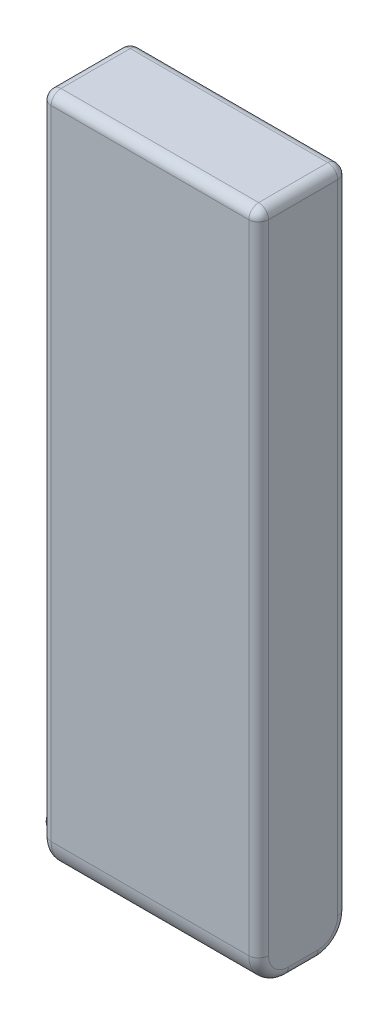
ISO-10303-21;
HEADER;
FILE_DESCRIPTION(('STEP AP214'),'2;1');
FILE_NAME('part.step','',(''),(''),'','','');
FILE_SCHEMA(('AUTOMOTIVE_DESIGN { 1 0 10303 214 1 1 1 1 }'));
ENDSEC;
DATA;
#1=APPLICATION_CONTEXT('core data for automotive mechanical design processes');
#2=APPLICATION_PROTOCOL_DEFINITION('international standard','automotive_design',2000,#1);
#3=PRODUCT_CONTEXT('',#1,'mechanical');
#4=PRODUCT('Part','Part','',(#3));
#5=PRODUCT_RELATED_PRODUCT_CATEGORY('part','',(#4));
#6=PRODUCT_DEFINITION_FORMATION('','',#4);
#7=PRODUCT_DEFINITION_CONTEXT('part definition',#1,'design');
#8=PRODUCT_DEFINITION('design','',#6,#7);
#9=PRODUCT_DEFINITION_SHAPE('','',#8);
#10=(LENGTH_UNIT() NAMED_UNIT(*) SI_UNIT(.MILLI.,.METRE.));
#11=(NAMED_UNIT(*) PLANE_ANGLE_UNIT() SI_UNIT($,.RADIAN.));
#12=(NAMED_UNIT(*) SI_UNIT($,.STERADIAN.) SOLID_ANGLE_UNIT());
#13=UNCERTAINTY_MEASURE_WITH_UNIT(LENGTH_MEASURE(1.E-05),#10,'distance_accuracy_value','');
#14=(GEOMETRIC_REPRESENTATION_CONTEXT(3) GLOBAL_UNCERTAINTY_ASSIGNED_CONTEXT((#13)) GLOBAL_UNIT_ASSIGNED_CONTEXT((#10,
#11,#12)) REPRESENTATION_CONTEXT('',''));
#15=CARTESIAN_POINT('',(0.,0.,0.));
#16=DIRECTION('',(0.,0.,1.));
#17=DIRECTION('',(1.,0.,0.));
#18=AXIS2_PLACEMENT_3D('',#15,#16,#17);
#19=CARTESIAN_POINT('',(22.,68.5,18.));
#20=DIRECTION('',(0.,-1.,0.));
#21=DIRECTION('',(0.,0.,-1.));
#22=AXIS2_PLACEMENT_3D('',#19,#20,#21);
#23=PLANE('',#22);
#24=DIRECTION('',(0.,0.,-1.));
#25=VECTOR('',#24,1.);
#26=CARTESIAN_POINT('',(20.,68.5,18.));
#27=LINE('',#26,#25);
#28=CARTESIAN_POINT('',(20.,68.5,16.));
#29=VERTEX_POINT('',#28);
#30=CARTESIAN_POINT('',(20.,68.5,2.));
#31=VERTEX_POINT('',#30);
#32=EDGE_CURVE('E180',#29,#31,#27,.T.);
#33=ORIENTED_EDGE('',*,*,#32,.T.);
#34=DIRECTION('',(-1.,0.,0.));
#35=VECTOR('',#34,1.);
#36=CARTESIAN_POINT('',(-22.,68.5,2.));
#37=LINE('',#36,#35);
#38=CARTESIAN_POINT('',(-20.,68.5,2.));
#39=VERTEX_POINT('',#38);
#40=EDGE_CURVE('E283',#31,#39,#37,.T.);
#41=ORIENTED_EDGE('',*,*,#40,.T.);
#42=DIRECTION('',(0.,0.,-1.));
#43=VECTOR('',#42,1.);
#44=CARTESIAN_POINT('',(-20.,68.5,18.));
#45=LINE('',#44,#43);
#46=CARTESIAN_POINT('',(-20.,68.5,16.));
#47=VERTEX_POINT('',#46);
#48=EDGE_CURVE('E281',#39,#47,#45,.F.);
#49=ORIENTED_EDGE('',*,*,#48,.T.);
#50=DIRECTION('',(-1.,0.,0.));
#51=VECTOR('',#50,1.);
#52=CARTESIAN_POINT('',(22.,68.5,16.));
#53=LINE('',#52,#51);
#54=EDGE_CURVE('E276',#47,#29,#53,.F.);
#55=ORIENTED_EDGE('',*,*,#54,.T.);
#56=EDGE_LOOP('',(#33,#41,#49,#55));
#57=FACE_BOUND('',#56,.T.);
#58=ADVANCED_FACE('F50',(#57),#23,.F.);
#59=CARTESIAN_POINT('',(-22.,-68.5,18.));
#60=DIRECTION('',(1.,0.,0.));
#61=DIRECTION('',(0.,0.,-1.));
#62=AXIS2_PLACEMENT_3D('',#59,#60,#61);
#63=PLANE('',#62);
#64=CARTESIAN_POINT('',(-22.,-62.5,12.5));
#65=DIRECTION('',(1.,0.,0.));
#66=DIRECTION('',(0.,0.,-1.));
#67=AXIS2_PLACEMENT_3D('',#64,#65,#66);
#68=CIRCLE('',#67,2.5);
#69=CARTESIAN_POINT('',(-22.,-62.5,10.));
#70=VERTEX_POINT('',#69);
#71=EDGE_CURVE('E11',#70,#70,#68,.F.);
#72=ORIENTED_EDGE('',*,*,#71,.F.);
#73=EDGE_LOOP('',(#72));
#74=FACE_BOUND('',#73,.T.);
#75=CARTESIAN_POINT('',(-22.,-62.5,5.5));
#76=DIRECTION('',(1.,0.,0.));
#77=DIRECTION('',(0.,0.,-1.));
#78=AXIS2_PLACEMENT_3D('',#75,#76,#77);
#79=CIRCLE('',#78,2.5);
#80=CARTESIAN_POINT('',(-22.,-62.5,3.00000000000001));
#81=VERTEX_POINT('',#80);
#82=EDGE_CURVE('E54',#81,#81,#79,.F.);
#83=ORIENTED_EDGE('',*,*,#82,.F.);
#84=EDGE_LOOP('',(#83));
#85=FACE_BOUND('',#84,.T.);
#86=DIRECTION('',(0.,0.,-1.));
#87=VECTOR('',#86,1.);
#88=CARTESIAN_POINT('',(-22.,66.5,18.));
#89=LINE('',#88,#87);
#90=CARTESIAN_POINT('',(-22.,66.5,16.));
#91=VERTEX_POINT('',#90);
#92=CARTESIAN_POINT('',(-22.,66.5,2.));
#93=VERTEX_POINT('',#92);
#94=EDGE_CURVE('E268',#91,#93,#89,.T.);
#95=ORIENTED_EDGE('',*,*,#94,.T.);
#96=DIRECTION('',(0.,-1.,0.));
#97=VECTOR('',#96,1.);
#98=CARTESIAN_POINT('',(-22.,-62.5,2.));
#99=LINE('',#98,#97);
#100=CARTESIAN_POINT('',(-22.,-62.5,2.));
#101=VERTEX_POINT('',#100);
#102=EDGE_CURVE('E277',#93,#101,#99,.T.);
#103=ORIENTED_EDGE('',*,*,#102,.T.);
#104=CARTESIAN_POINT('',(-22.,-62.5,6.));
#105=DIRECTION('',(1.,0.,0.));
#106=DIRECTION('',(0.,0.,-1.));
#107=AXIS2_PLACEMENT_3D('',#104,#105,#106);
#108=CIRCLE('',#107,4.);
#109=CARTESIAN_POINT('',(-22.,-66.5,6.));
#110=VERTEX_POINT('',#109);
#111=EDGE_CURVE('E273',#101,#110,#108,.F.);
#112=ORIENTED_EDGE('',*,*,#111,.T.);
#113=DIRECTION('',(0.,0.,-1.));
#114=VECTOR('',#113,1.);
#115=CARTESIAN_POINT('',(-22.,-66.5,18.));
#116=LINE('',#115,#114);
#117=CARTESIAN_POINT('',(-22.,-66.5,12.));
#118=VERTEX_POINT('',#117);
#119=EDGE_CURVE('E275',#110,#118,#116,.F.);
#120=ORIENTED_EDGE('',*,*,#119,.T.);
#121=CARTESIAN_POINT('',(-22.,-62.5,12.));
#122=DIRECTION('',(1.,0.,0.));
#123=DIRECTION('',(0.,0.,-1.));
#124=AXIS2_PLACEMENT_3D('',#121,#122,#123);
#125=CIRCLE('',#124,4.);
#126=CARTESIAN_POINT('',(-22.,-62.5,16.));
#127=VERTEX_POINT('',#126);
#128=EDGE_CURVE('E269',#118,#127,#125,.F.);
#129=ORIENTED_EDGE('',*,*,#128,.T.);
#130=DIRECTION('',(0.,-1.,0.));
#131=VECTOR('',#130,1.);
#132=CARTESIAN_POINT('',(-22.,-68.5,16.));
#133=LINE('',#132,#131);
#134=EDGE_CURVE('E266',#127,#91,#133,.F.);
#135=ORIENTED_EDGE('',*,*,#134,.T.);
#136=EDGE_LOOP('',(#95,#103,#112,#120,#129,#135));
#137=FACE_BOUND('',#136,.T.);
#138=ADVANCED_FACE('F303',(#74,#85,#137),#63,.F.);
#139=CARTESIAN_POINT('',(22.,-68.5,18.));
#140=DIRECTION('',(0.,1.,0.));
#141=DIRECTION('',(0.,0.,1.));
#142=AXIS2_PLACEMENT_3D('',#139,#140,#141);
#143=PLANE('',#142);
#144=DIRECTION('',(1.,0.,0.));
#145=VECTOR('',#144,1.);
#146=CARTESIAN_POINT('',(22.,-68.5,6.));
#147=LINE('',#146,#145);
#148=CARTESIAN_POINT('',(-20.,-68.5,6.));
#149=VERTEX_POINT('',#148);
#150=CARTESIAN_POINT('',(20.,-68.5,6.));
#151=VERTEX_POINT('',#150);
#152=EDGE_CURVE('E314',#149,#151,#147,.T.);
#153=ORIENTED_EDGE('',*,*,#152,.T.);
#154=DIRECTION('',(0.,0.,-1.));
#155=VECTOR('',#154,1.);
#156=CARTESIAN_POINT('',(20.,-68.5,18.));
#157=LINE('',#156,#155);
#158=CARTESIAN_POINT('',(20.,-68.5,12.));
#159=VERTEX_POINT('',#158);
#160=EDGE_CURVE('E253',#151,#159,#157,.F.);
#161=ORIENTED_EDGE('',*,*,#160,.T.);
#162=DIRECTION('',(1.,0.,0.));
#163=VECTOR('',#162,1.);
#164=CARTESIAN_POINT('',(22.,-68.5,12.));
#165=LINE('',#164,#163);
#166=CARTESIAN_POINT('',(-20.,-68.5,12.));
#167=VERTEX_POINT('',#166);
#168=EDGE_CURVE('E217',#159,#167,#165,.F.);
#169=ORIENTED_EDGE('',*,*,#168,.T.);
#170=DIRECTION('',(0.,0.,-1.));
#171=VECTOR('',#170,1.);
#172=CARTESIAN_POINT('',(-20.,-68.5,18.));
#173=LINE('',#172,#171);
#174=EDGE_CURVE('E256',#167,#149,#173,.T.);
#175=ORIENTED_EDGE('',*,*,#174,.T.);
#176=EDGE_LOOP('',(#153,#161,#169,#175));
#177=FACE_BOUND('',#176,.T.);
#178=ADVANCED_FACE('F311',(#177),#143,.F.);
#179=CARTESIAN_POINT('',(22.,-68.5,18.));
#180=DIRECTION('',(-1.,0.,0.));
#181=DIRECTION('',(0.,0.,1.));
#182=AXIS2_PLACEMENT_3D('',#179,#180,#181);
#183=PLANE('',#182);
#184=CARTESIAN_POINT('',(22.,-62.5,6.));
#185=DIRECTION('',(-1.,0.,0.));
#186=DIRECTION('',(0.,0.,1.));
#187=AXIS2_PLACEMENT_3D('',#184,#185,#186);
#188=CIRCLE('',#187,4.);
#189=CARTESIAN_POINT('',(22.,-66.5,6.));
#190=VERTEX_POINT('',#189);
#191=CARTESIAN_POINT('',(22.,-62.5,2.));
#192=VERTEX_POINT('',#191);
#193=EDGE_CURVE('E244',#190,#192,#188,.F.);
#194=ORIENTED_EDGE('',*,*,#193,.T.);
#195=DIRECTION('',(0.,1.,0.));
#196=VECTOR('',#195,1.);
#197=CARTESIAN_POINT('',(22.,68.5,2.));
#198=LINE('',#197,#196);
#199=CARTESIAN_POINT('',(22.,66.5,2.));
#200=VERTEX_POINT('',#199);
#201=EDGE_CURVE('E153',#192,#200,#198,.T.);
#202=ORIENTED_EDGE('',*,*,#201,.T.);
#203=DIRECTION('',(0.,0.,-1.));
#204=VECTOR('',#203,1.);
#205=CARTESIAN_POINT('',(22.,66.5,18.));
#206=LINE('',#205,#204);
#207=CARTESIAN_POINT('',(22.,66.5,16.));
#208=VERTEX_POINT('',#207);
#209=EDGE_CURVE('E150',#200,#208,#206,.F.);
#210=ORIENTED_EDGE('',*,*,#209,.T.);
#211=DIRECTION('',(0.,1.,0.));
#212=VECTOR('',#211,1.);
#213=CARTESIAN_POINT('',(22.,-68.5,16.));
#214=LINE('',#213,#212);
#215=CARTESIAN_POINT('',(22.,-62.5,16.));
#216=VERTEX_POINT('',#215);
#217=EDGE_CURVE('E147',#208,#216,#214,.F.);
#218=ORIENTED_EDGE('',*,*,#217,.T.);
#219=CARTESIAN_POINT('',(22.,-62.5,12.));
#220=DIRECTION('',(-1.,0.,0.));
#221=DIRECTION('',(0.,0.,1.));
#222=AXIS2_PLACEMENT_3D('',#219,#220,#221);
#223=CIRCLE('',#222,4.);
#224=CARTESIAN_POINT('',(22.,-66.5,12.));
#225=VERTEX_POINT('',#224);
#226=EDGE_CURVE('E160',#216,#225,#223,.F.);
#227=ORIENTED_EDGE('',*,*,#226,.T.);
#228=DIRECTION('',(0.,0.,-1.));
#229=VECTOR('',#228,1.);
#230=CARTESIAN_POINT('',(22.,-66.5,18.));
#231=LINE('',#230,#229);
#232=EDGE_CURVE('E250',#225,#190,#231,.T.);
#233=ORIENTED_EDGE('',*,*,#232,.T.);
#234=EDGE_LOOP('',(#194,#202,#210,#218,#227,#233));
#235=FACE_BOUND('',#234,.T.);
#236=ADVANCED_FACE('F149',(#235),#183,.F.);
#237=CARTESIAN_POINT('',(0.,0.,18.));
#238=DIRECTION('',(0.,0.,-1.));
#239=DIRECTION('',(-1.,0.,0.));
#240=AXIS2_PLACEMENT_3D('',#237,#238,#239);
#241=PLANE('',#240);
#242=DIRECTION('',(1.,0.,0.));
#243=VECTOR('',#242,1.);
#244=CARTESIAN_POINT('',(0.,-62.5,18.));
#245=LINE('',#244,#243);
#246=CARTESIAN_POINT('',(-20.,-62.5,18.));
#247=VERTEX_POINT('',#246);
#248=CARTESIAN_POINT('',(20.,-62.5,18.));
#249=VERTEX_POINT('',#248);
#250=EDGE_CURVE('E169',#247,#249,#245,.T.);
#251=ORIENTED_EDGE('',*,*,#250,.T.);
#252=DIRECTION('',(0.,1.,0.));
#253=VECTOR('',#252,1.);
#254=CARTESIAN_POINT('',(20.,0.,18.));
#255=LINE('',#254,#253);
#256=CARTESIAN_POINT('',(20.,66.5,18.));
#257=VERTEX_POINT('',#256);
#258=EDGE_CURVE('E65',#249,#257,#255,.T.);
#259=ORIENTED_EDGE('',*,*,#258,.T.);
#260=DIRECTION('',(-1.,0.,0.));
#261=VECTOR('',#260,1.);
#262=CARTESIAN_POINT('',(0.,66.5,18.));
#263=LINE('',#262,#261);
#264=CARTESIAN_POINT('',(-20.,66.5,18.));
#265=VERTEX_POINT('',#264);
#266=EDGE_CURVE('E66',#257,#265,#263,.T.);
#267=ORIENTED_EDGE('',*,*,#266,.T.);
#268=DIRECTION('',(0.,-1.,0.));
#269=VECTOR('',#268,1.);
#270=CARTESIAN_POINT('',(-20.,0.,18.));
#271=LINE('',#270,#269);
#272=EDGE_CURVE('E224',#265,#247,#271,.T.);
#273=ORIENTED_EDGE('',*,*,#272,.T.);
#274=EDGE_LOOP('',(#251,#259,#267,#273));
#275=FACE_BOUND('',#274,.T.);
#276=ADVANCED_FACE('F286',(#275),#241,.F.);
#277=CARTESIAN_POINT('',(0.,0.,0.));
#278=DIRECTION('',(0.,0.,-1.));
#279=DIRECTION('',(-1.,0.,0.));
#280=AXIS2_PLACEMENT_3D('',#277,#278,#279);
#281=PLANE('',#280);
#282=DIRECTION('',(-1.,0.,0.));
#283=VECTOR('',#282,1.);
#284=CARTESIAN_POINT('',(22.,66.5,0.));
#285=LINE('',#284,#283);
#286=CARTESIAN_POINT('',(-20.,66.5,0.));
#287=VERTEX_POINT('',#286);
#288=CARTESIAN_POINT('',(20.,66.5,0.));
#289=VERTEX_POINT('',#288);
#290=EDGE_CURVE('E328',#287,#289,#285,.F.);
#291=ORIENTED_EDGE('',*,*,#290,.T.);
#292=DIRECTION('',(0.,1.,0.));
#293=VECTOR('',#292,1.);
#294=CARTESIAN_POINT('',(20.,-62.5,0.));
#295=LINE('',#294,#293);
#296=CARTESIAN_POINT('',(20.,-62.5,0.));
#297=VERTEX_POINT('',#296);
#298=EDGE_CURVE('E334',#289,#297,#295,.F.);
#299=ORIENTED_EDGE('',*,*,#298,.T.);
#300=DIRECTION('',(1.,0.,0.));
#301=VECTOR('',#300,1.);
#302=CARTESIAN_POINT('',(-22.,-62.5,0.));
#303=LINE('',#302,#301);
#304=CARTESIAN_POINT('',(-20.,-62.5,0.));
#305=VERTEX_POINT('',#304);
#306=EDGE_CURVE('E291',#297,#305,#303,.F.);
#307=ORIENTED_EDGE('',*,*,#306,.T.);
#308=DIRECTION('',(0.,-1.,0.));
#309=VECTOR('',#308,1.);
#310=CARTESIAN_POINT('',(-20.,68.5,0.));
#311=LINE('',#310,#309);
#312=EDGE_CURVE('E332',#305,#287,#311,.F.);
#313=ORIENTED_EDGE('',*,*,#312,.T.);
#314=EDGE_LOOP('',(#291,#299,#307,#313));
#315=FACE_BOUND('',#314,.T.);
#316=ADVANCED_FACE('F340',(#315),#281,.T.);
#317=CARTESIAN_POINT('',(22.,-62.5,6.));
#318=DIRECTION('',(-1.,0.,0.));
#319=DIRECTION('',(0.,0.,1.));
#320=AXIS2_PLACEMENT_3D('',#317,#318,#319);
#321=CYLINDRICAL_SURFACE('',#320,6.);
#322=ORIENTED_EDGE('',*,*,#306,.F.);
#323=CARTESIAN_POINT('',(20.,-62.5,6.));
#324=DIRECTION('',(-1.,0.,0.));
#325=DIRECTION('',(0.,0.,1.));
#326=AXIS2_PLACEMENT_3D('',#323,#324,#325);
#327=CIRCLE('',#326,6.);
#328=EDGE_CURVE('E242',#297,#151,#327,.T.);
#329=ORIENTED_EDGE('',*,*,#328,.T.);
#330=ORIENTED_EDGE('',*,*,#152,.F.);
#331=CARTESIAN_POINT('',(-20.,-62.5,6.));
#332=DIRECTION('',(1.,0.,0.));
#333=DIRECTION('',(0.,0.,-1.));
#334=AXIS2_PLACEMENT_3D('',#331,#332,#333);
#335=CIRCLE('',#334,6.);
#336=EDGE_CURVE('E318',#149,#305,#335,.T.);
#337=ORIENTED_EDGE('',*,*,#336,.T.);
#338=EDGE_LOOP('',(#322,#329,#330,#337));
#339=FACE_BOUND('',#338,.T.);
#340=ADVANCED_FACE('F320',(#339),#321,.T.);
#341=CARTESIAN_POINT('',(0.,-62.5,12.));
#342=DIRECTION('',(1.,0.,0.));
#343=DIRECTION('',(0.,0.,-1.));
#344=AXIS2_PLACEMENT_3D('',#341,#342,#343);
#345=CYLINDRICAL_SURFACE('',#344,6.);
#346=ORIENTED_EDGE('',*,*,#168,.F.);
#347=CARTESIAN_POINT('',(20.,-62.5,12.));
#348=DIRECTION('',(-1.,0.,0.));
#349=DIRECTION('',(0.,0.,1.));
#350=AXIS2_PLACEMENT_3D('',#347,#348,#349);
#351=CIRCLE('',#350,6.);
#352=EDGE_CURVE('E257',#159,#249,#351,.T.);
#353=ORIENTED_EDGE('',*,*,#352,.T.);
#354=ORIENTED_EDGE('',*,*,#250,.F.);
#355=CARTESIAN_POINT('',(-20.,-62.5,12.));
#356=DIRECTION('',(1.,0.,0.));
#357=DIRECTION('',(0.,0.,-1.));
#358=AXIS2_PLACEMENT_3D('',#355,#356,#357);
#359=CIRCLE('',#358,6.);
#360=EDGE_CURVE('E260',#247,#167,#359,.T.);
#361=ORIENTED_EDGE('',*,*,#360,.T.);
#362=EDGE_LOOP('',(#346,#353,#354,#361));
#363=FACE_BOUND('',#362,.T.);
#364=ADVANCED_FACE('F292',(#363),#345,.T.);
#365=CARTESIAN_POINT('',(-20.,-62.5,12.));
#366=DIRECTION('',(1.,0.,0.));
#367=DIRECTION('',(0.,0.,-1.));
#368=AXIS2_PLACEMENT_3D('',#365,#366,#367);
#369=TOROIDAL_SURFACE('',#368,4.,2.);
#370=CARTESIAN_POINT('',(-20.,-66.5,12.));
#371=DIRECTION('',(0.,0.,-1.));
#372=DIRECTION('',(-1.,0.,0.));
#373=AXIS2_PLACEMENT_3D('',#370,#371,#372);
#374=CIRCLE('',#373,2.);
#375=EDGE_CURVE('E213',#167,#118,#374,.T.);
#376=ORIENTED_EDGE('',*,*,#375,.F.);
#377=ORIENTED_EDGE('',*,*,#360,.F.);
#378=CARTESIAN_POINT('',(-20.,-62.5,16.));
#379=DIRECTION('',(0.,1.,0.));
#380=DIRECTION('',(0.,0.,1.));
#381=AXIS2_PLACEMENT_3D('',#378,#379,#380);
#382=CIRCLE('',#381,2.);
#383=EDGE_CURVE('E216',#127,#247,#382,.T.);
#384=ORIENTED_EDGE('',*,*,#383,.F.);
#385=ORIENTED_EDGE('',*,*,#128,.F.);
#386=EDGE_LOOP('',(#376,#377,#384,#385));
#387=FACE_BOUND('',#386,.T.);
#388=ADVANCED_FACE('F47',(#387),#369,.T.);
#389=CARTESIAN_POINT('',(-20.,0.,16.));
#390=DIRECTION('',(0.,-1.,0.));
#391=DIRECTION('',(0.,0.,-1.));
#392=AXIS2_PLACEMENT_3D('',#389,#390,#391);
#393=CYLINDRICAL_SURFACE('',#392,2.);
#394=ORIENTED_EDGE('',*,*,#383,.T.);
#395=ORIENTED_EDGE('',*,*,#272,.F.);
#396=CARTESIAN_POINT('',(-20.,66.5,16.));
#397=DIRECTION('',(0.,1.,0.));
#398=DIRECTION('',(0.,0.,1.));
#399=AXIS2_PLACEMENT_3D('',#396,#397,#398);
#400=CIRCLE('',#399,2.);
#401=EDGE_CURVE('E209',#91,#265,#400,.T.);
#402=ORIENTED_EDGE('',*,*,#401,.F.);
#403=ORIENTED_EDGE('',*,*,#134,.F.);
#404=EDGE_LOOP('',(#394,#395,#402,#403));
#405=FACE_BOUND('',#404,.T.);
#406=ADVANCED_FACE('F301',(#405),#393,.T.);
#407=CARTESIAN_POINT('',(-20.,-66.5,18.));
#408=DIRECTION('',(0.,0.,-1.));
#409=DIRECTION('',(-1.,0.,0.));
#410=AXIS2_PLACEMENT_3D('',#407,#408,#409);
#411=CYLINDRICAL_SURFACE('',#410,2.);
#412=ORIENTED_EDGE('',*,*,#375,.T.);
#413=ORIENTED_EDGE('',*,*,#119,.F.);
#414=CARTESIAN_POINT('',(-20.,-66.5,6.));
#415=DIRECTION('',(0.,0.,-1.));
#416=DIRECTION('',(-1.,0.,0.));
#417=AXIS2_PLACEMENT_3D('',#414,#415,#416);
#418=CIRCLE('',#417,2.);
#419=EDGE_CURVE('E210',#149,#110,#418,.T.);
#420=ORIENTED_EDGE('',*,*,#419,.F.);
#421=ORIENTED_EDGE('',*,*,#174,.F.);
#422=EDGE_LOOP('',(#412,#413,#420,#421));
#423=FACE_BOUND('',#422,.T.);
#424=ADVANCED_FACE('F310',(#423),#411,.T.);
#425=CARTESIAN_POINT('',(-20.,66.5,16.));
#426=DIRECTION('',(0.,0.,1.));
#427=DIRECTION('',(1.,0.,0.));
#428=AXIS2_PLACEMENT_3D('',#425,#426,#427);
#429=SPHERICAL_SURFACE('',#428,2.);
#430=CARTESIAN_POINT('',(-20.,66.5,16.));
#431=DIRECTION('',(0.,0.,1.));
#432=DIRECTION('',(1.,0.,0.));
#433=AXIS2_PLACEMENT_3D('',#430,#431,#432);
#434=CIRCLE('',#433,2.);
#435=EDGE_CURVE('E203',#91,#47,#434,.F.);
#436=ORIENTED_EDGE('',*,*,#435,.F.);
#437=ORIENTED_EDGE('',*,*,#401,.T.);
#438=CARTESIAN_POINT('',(-20.,66.5,16.));
#439=DIRECTION('',(-1.,0.,0.));
#440=DIRECTION('',(0.,0.,1.));
#441=AXIS2_PLACEMENT_3D('',#438,#439,#440);
#442=CIRCLE('',#441,2.);
#443=EDGE_CURVE('E204',#47,#265,#442,.F.);
#444=ORIENTED_EDGE('',*,*,#443,.F.);
#445=EDGE_LOOP('',(#436,#437,#444));
#446=FACE_BOUND('',#445,.T.);
#447=ADVANCED_FACE('F357',(#446),#429,.T.);
#448=CARTESIAN_POINT('',(-20.,-62.5,6.));
#449=DIRECTION('',(1.,0.,0.));
#450=DIRECTION('',(0.,0.,-1.));
#451=AXIS2_PLACEMENT_3D('',#448,#449,#450);
#452=TOROIDAL_SURFACE('',#451,4.,2.);
#453=ORIENTED_EDGE('',*,*,#419,.T.);
#454=ORIENTED_EDGE('',*,*,#111,.F.);
#455=CARTESIAN_POINT('',(-20.,-62.5,2.));
#456=DIRECTION('',(0.,1.,0.));
#457=DIRECTION('',(0.,0.,1.));
#458=AXIS2_PLACEMENT_3D('',#455,#456,#457);
#459=CIRCLE('',#458,2.);
#460=EDGE_CURVE('E200',#305,#101,#459,.T.);
#461=ORIENTED_EDGE('',*,*,#460,.F.);
#462=ORIENTED_EDGE('',*,*,#336,.F.);
#463=EDGE_LOOP('',(#453,#454,#461,#462));
#464=FACE_BOUND('',#463,.T.);
#465=ADVANCED_FACE('F369',(#464),#452,.T.);
#466=CARTESIAN_POINT('',(20.,0.,16.));
#467=DIRECTION('',(0.,1.,0.));
#468=DIRECTION('',(0.,0.,1.));
#469=AXIS2_PLACEMENT_3D('',#466,#467,#468);
#470=CYLINDRICAL_SURFACE('',#469,2.);
#471=CARTESIAN_POINT('',(20.,66.5,16.));
#472=DIRECTION('',(0.,1.,0.));
#473=DIRECTION('',(0.,0.,1.));
#474=AXIS2_PLACEMENT_3D('',#471,#472,#473);
#475=CIRCLE('',#474,2.);
#476=EDGE_CURVE('E162',#257,#208,#475,.T.);
#477=ORIENTED_EDGE('',*,*,#476,.F.);
#478=ORIENTED_EDGE('',*,*,#258,.F.);
#479=CARTESIAN_POINT('',(20.,-62.5,16.));
#480=DIRECTION('',(0.,-1.,0.));
#481=DIRECTION('',(0.,0.,-1.));
#482=AXIS2_PLACEMENT_3D('',#479,#480,#481);
#483=CIRCLE('',#482,2.);
#484=EDGE_CURVE('E167',#216,#249,#483,.T.);
#485=ORIENTED_EDGE('',*,*,#484,.F.);
#486=ORIENTED_EDGE('',*,*,#217,.F.);
#487=EDGE_LOOP('',(#477,#478,#485,#486));
#488=FACE_BOUND('',#487,.T.);
#489=ADVANCED_FACE('F165',(#488),#470,.T.);
#490=CARTESIAN_POINT('',(0.,66.5,16.));
#491=DIRECTION('',(-1.,0.,0.));
#492=DIRECTION('',(0.,0.,1.));
#493=AXIS2_PLACEMENT_3D('',#490,#491,#492);
#494=CYLINDRICAL_SURFACE('',#493,2.);
#495=ORIENTED_EDGE('',*,*,#443,.T.);
#496=ORIENTED_EDGE('',*,*,#266,.F.);
#497=CARTESIAN_POINT('',(20.,66.5,16.));
#498=DIRECTION('',(1.,0.,0.));
#499=DIRECTION('',(0.,0.,-1.));
#500=AXIS2_PLACEMENT_3D('',#497,#498,#499);
#501=CIRCLE('',#500,2.);
#502=EDGE_CURVE('E176',#29,#257,#501,.T.);
#503=ORIENTED_EDGE('',*,*,#502,.F.);
#504=ORIENTED_EDGE('',*,*,#54,.F.);
#505=EDGE_LOOP('',(#495,#496,#503,#504));
#506=FACE_BOUND('',#505,.T.);
#507=ADVANCED_FACE('F353',(#506),#494,.T.);
#508=CARTESIAN_POINT('',(-20.,66.5,18.));
#509=DIRECTION('',(0.,0.,-1.));
#510=DIRECTION('',(-1.,0.,0.));
#511=AXIS2_PLACEMENT_3D('',#508,#509,#510);
#512=CYLINDRICAL_SURFACE('',#511,2.);
#513=ORIENTED_EDGE('',*,*,#435,.T.);
#514=ORIENTED_EDGE('',*,*,#48,.F.);
#515=CARTESIAN_POINT('',(-20.,66.5,2.));
#516=DIRECTION('',(0.,0.,-1.));
#517=DIRECTION('',(-1.,0.,0.));
#518=AXIS2_PLACEMENT_3D('',#515,#516,#517);
#519=CIRCLE('',#518,2.);
#520=EDGE_CURVE('E193',#93,#39,#519,.T.);
#521=ORIENTED_EDGE('',*,*,#520,.F.);
#522=ORIENTED_EDGE('',*,*,#94,.F.);
#523=EDGE_LOOP('',(#513,#514,#521,#522));
#524=FACE_BOUND('',#523,.T.);
#525=ADVANCED_FACE('F360',(#524),#512,.T.);
#526=CARTESIAN_POINT('',(-20.,-68.5,2.));
#527=DIRECTION('',(0.,1.,0.));
#528=DIRECTION('',(0.,0.,1.));
#529=AXIS2_PLACEMENT_3D('',#526,#527,#528);
#530=CYLINDRICAL_SURFACE('',#529,2.);
#531=ORIENTED_EDGE('',*,*,#460,.T.);
#532=ORIENTED_EDGE('',*,*,#102,.F.);
#533=CARTESIAN_POINT('',(-20.,66.5,2.));
#534=DIRECTION('',(0.,1.,0.));
#535=DIRECTION('',(0.,0.,1.));
#536=AXIS2_PLACEMENT_3D('',#533,#534,#535);
#537=CIRCLE('',#536,2.);
#538=EDGE_CURVE('E183',#287,#93,#537,.T.);
#539=ORIENTED_EDGE('',*,*,#538,.F.);
#540=ORIENTED_EDGE('',*,*,#312,.F.);
#541=EDGE_LOOP('',(#531,#532,#539,#540));
#542=FACE_BOUND('',#541,.T.);
#543=ADVANCED_FACE('F368',(#542),#530,.T.);
#544=CARTESIAN_POINT('',(20.,-62.5,12.));
#545=DIRECTION('',(-1.,0.,0.));
#546=DIRECTION('',(0.,0.,1.));
#547=AXIS2_PLACEMENT_3D('',#544,#545,#546);
#548=TOROIDAL_SURFACE('',#547,4.,2.);
#549=ORIENTED_EDGE('',*,*,#484,.T.);
#550=ORIENTED_EDGE('',*,*,#352,.F.);
#551=CARTESIAN_POINT('',(20.,-66.5,12.));
#552=DIRECTION('',(0.,0.,-1.));
#553=DIRECTION('',(-1.,0.,0.));
#554=AXIS2_PLACEMENT_3D('',#551,#552,#553);
#555=CIRCLE('',#554,2.);
#556=EDGE_CURVE('E182',#225,#159,#555,.T.);
#557=ORIENTED_EDGE('',*,*,#556,.F.);
#558=ORIENTED_EDGE('',*,*,#226,.F.);
#559=EDGE_LOOP('',(#549,#550,#557,#558));
#560=FACE_BOUND('',#559,.T.);
#561=ADVANCED_FACE('F407',(#560),#548,.T.);
#562=CARTESIAN_POINT('',(20.,66.5,16.));
#563=DIRECTION('',(0.,0.,1.));
#564=DIRECTION('',(1.,0.,0.));
#565=AXIS2_PLACEMENT_3D('',#562,#563,#564);
#566=SPHERICAL_SURFACE('',#565,2.);
#567=ORIENTED_EDGE('',*,*,#502,.T.);
#568=ORIENTED_EDGE('',*,*,#476,.T.);
#569=CARTESIAN_POINT('',(20.,66.5,16.));
#570=DIRECTION('',(0.,0.,1.));
#571=DIRECTION('',(1.,0.,0.));
#572=AXIS2_PLACEMENT_3D('',#569,#570,#571);
#573=CIRCLE('',#572,2.);
#574=EDGE_CURVE('E172',#29,#208,#573,.F.);
#575=ORIENTED_EDGE('',*,*,#574,.F.);
#576=EDGE_LOOP('',(#567,#568,#575));
#577=FACE_BOUND('',#576,.T.);
#578=ADVANCED_FACE('F175',(#577),#566,.T.);
#579=CARTESIAN_POINT('',(-20.,66.5,2.));
#580=DIRECTION('',(-1.,0.,0.));
#581=DIRECTION('',(0.,0.,1.));
#582=AXIS2_PLACEMENT_3D('',#579,#580,#581);
#583=SPHERICAL_SURFACE('',#582,2.);
#584=ORIENTED_EDGE('',*,*,#538,.T.);
#585=ORIENTED_EDGE('',*,*,#520,.T.);
#586=CARTESIAN_POINT('',(-20.,66.5,2.));
#587=DIRECTION('',(-1.,0.,0.));
#588=DIRECTION('',(0.,0.,1.));
#589=AXIS2_PLACEMENT_3D('',#586,#587,#588);
#590=CIRCLE('',#589,2.);
#591=EDGE_CURVE('E185',#287,#39,#590,.F.);
#592=ORIENTED_EDGE('',*,*,#591,.F.);
#593=EDGE_LOOP('',(#584,#585,#592));
#594=FACE_BOUND('',#593,.T.);
#595=ADVANCED_FACE('F361',(#594),#583,.T.);
#596=CARTESIAN_POINT('',(20.,-66.5,18.));
#597=DIRECTION('',(0.,0.,-1.));
#598=DIRECTION('',(-1.,0.,0.));
#599=AXIS2_PLACEMENT_3D('',#596,#597,#598);
#600=CYLINDRICAL_SURFACE('',#599,2.);
#601=ORIENTED_EDGE('',*,*,#556,.T.);
#602=ORIENTED_EDGE('',*,*,#160,.F.);
#603=CARTESIAN_POINT('',(20.,-66.5,6.));
#604=DIRECTION('',(0.,0.,-1.));
#605=DIRECTION('',(-1.,0.,0.));
#606=AXIS2_PLACEMENT_3D('',#603,#604,#605);
#607=CIRCLE('',#606,2.);
#608=EDGE_CURVE('E187',#190,#151,#607,.T.);
#609=ORIENTED_EDGE('',*,*,#608,.F.);
#610=ORIENTED_EDGE('',*,*,#232,.F.);
#611=EDGE_LOOP('',(#601,#602,#609,#610));
#612=FACE_BOUND('',#611,.T.);
#613=ADVANCED_FACE('F248',(#612),#600,.T.);
#614=CARTESIAN_POINT('',(20.,66.5,18.));
#615=DIRECTION('',(0.,0.,-1.));
#616=DIRECTION('',(-1.,0.,0.));
#617=AXIS2_PLACEMENT_3D('',#614,#615,#616);
#618=CYLINDRICAL_SURFACE('',#617,2.);
#619=ORIENTED_EDGE('',*,*,#574,.T.);
#620=ORIENTED_EDGE('',*,*,#209,.F.);
#621=CARTESIAN_POINT('',(20.,66.5,2.));
#622=DIRECTION('',(0.,0.,-1.));
#623=DIRECTION('',(-1.,0.,0.));
#624=AXIS2_PLACEMENT_3D('',#621,#622,#623);
#625=CIRCLE('',#624,2.);
#626=EDGE_CURVE('E233',#31,#200,#625,.T.);
#627=ORIENTED_EDGE('',*,*,#626,.F.);
#628=ORIENTED_EDGE('',*,*,#32,.F.);
#629=EDGE_LOOP('',(#619,#620,#627,#628));
#630=FACE_BOUND('',#629,.T.);
#631=ADVANCED_FACE('F179',(#630),#618,.T.);
#632=CARTESIAN_POINT('',(22.,66.5,2.));
#633=DIRECTION('',(1.,0.,0.));
#634=DIRECTION('',(0.,0.,-1.));
#635=AXIS2_PLACEMENT_3D('',#632,#633,#634);
#636=CYLINDRICAL_SURFACE('',#635,2.);
#637=ORIENTED_EDGE('',*,*,#591,.T.);
#638=ORIENTED_EDGE('',*,*,#40,.F.);
#639=CARTESIAN_POINT('',(20.,66.5,2.));
#640=DIRECTION('',(1.,0.,0.));
#641=DIRECTION('',(0.,0.,-1.));
#642=AXIS2_PLACEMENT_3D('',#639,#640,#641);
#643=CIRCLE('',#642,2.);
#644=EDGE_CURVE('E232',#289,#31,#643,.T.);
#645=ORIENTED_EDGE('',*,*,#644,.F.);
#646=ORIENTED_EDGE('',*,*,#290,.F.);
#647=EDGE_LOOP('',(#637,#638,#645,#646));
#648=FACE_BOUND('',#647,.T.);
#649=ADVANCED_FACE('F346',(#648),#636,.T.);
#650=CARTESIAN_POINT('',(20.,-62.5,6.));
#651=DIRECTION('',(-1.,0.,0.));
#652=DIRECTION('',(0.,0.,1.));
#653=AXIS2_PLACEMENT_3D('',#650,#651,#652);
#654=TOROIDAL_SURFACE('',#653,4.,2.);
#655=ORIENTED_EDGE('',*,*,#608,.T.);
#656=ORIENTED_EDGE('',*,*,#328,.F.);
#657=CARTESIAN_POINT('',(20.,-62.5,2.));
#658=DIRECTION('',(0.,1.,0.));
#659=DIRECTION('',(0.,0.,1.));
#660=AXIS2_PLACEMENT_3D('',#657,#658,#659);
#661=CIRCLE('',#660,2.);
#662=EDGE_CURVE('E228',#192,#297,#661,.T.);
#663=ORIENTED_EDGE('',*,*,#662,.F.);
#664=ORIENTED_EDGE('',*,*,#193,.F.);
#665=EDGE_LOOP('',(#655,#656,#663,#664));
#666=FACE_BOUND('',#665,.T.);
#667=ADVANCED_FACE('F241',(#666),#654,.T.);
#668=CARTESIAN_POINT('',(20.,66.5,2.));
#669=DIRECTION('',(0.,1.,0.));
#670=DIRECTION('',(0.,0.,1.));
#671=AXIS2_PLACEMENT_3D('',#668,#669,#670);
#672=SPHERICAL_SURFACE('',#671,2.);
#673=ORIENTED_EDGE('',*,*,#644,.T.);
#674=ORIENTED_EDGE('',*,*,#626,.T.);
#675=CARTESIAN_POINT('',(20.,66.5,2.));
#676=DIRECTION('',(0.,1.,0.));
#677=DIRECTION('',(0.,0.,1.));
#678=AXIS2_PLACEMENT_3D('',#675,#676,#677);
#679=CIRCLE('',#678,2.);
#680=EDGE_CURVE('E230',#289,#200,#679,.F.);
#681=ORIENTED_EDGE('',*,*,#680,.F.);
#682=EDGE_LOOP('',(#673,#674,#681));
#683=FACE_BOUND('',#682,.T.);
#684=ADVANCED_FACE('F345',(#683),#672,.T.);
#685=CARTESIAN_POINT('',(20.,-68.5,2.));
#686=DIRECTION('',(0.,-1.,0.));
#687=DIRECTION('',(0.,0.,-1.));
#688=AXIS2_PLACEMENT_3D('',#685,#686,#687);
#689=CYLINDRICAL_SURFACE('',#688,2.);
#690=ORIENTED_EDGE('',*,*,#662,.T.);
#691=ORIENTED_EDGE('',*,*,#298,.F.);
#692=ORIENTED_EDGE('',*,*,#680,.T.);
#693=ORIENTED_EDGE('',*,*,#201,.F.);
#694=EDGE_LOOP('',(#690,#691,#692,#693));
#695=FACE_BOUND('',#694,.T.);
#696=ADVANCED_FACE('F344',(#695),#689,.T.);
#697=CARTESIAN_POINT('',(-24.,-62.5,5.5));
#698=DIRECTION('',(1.,0.,0.));
#699=DIRECTION('',(0.,0.,-1.));
#700=AXIS2_PLACEMENT_3D('',#697,#698,#699);
#701=CYLINDRICAL_SURFACE('',#700,2.5);
#702=CARTESIAN_POINT('',(-24.,-62.5,5.5));
#703=DIRECTION('',(-1.,0.,0.));
#704=DIRECTION('',(0.,0.,1.));
#705=AXIS2_PLACEMENT_3D('',#702,#703,#704);
#706=CIRCLE('',#705,2.5);
#707=CARTESIAN_POINT('',(-24.,-62.5,8.));
#708=VERTEX_POINT('',#707);
#709=EDGE_CURVE('E809',#708,#708,#706,.T.);
#710=ORIENTED_EDGE('',*,*,#709,.F.);
#711=EDGE_LOOP('',(#710));
#712=FACE_BOUND('',#711,.T.);
#713=ORIENTED_EDGE('',*,*,#82,.T.);
#714=EDGE_LOOP('',(#713));
#715=FACE_BOUND('',#714,.T.);
#716=ADVANCED_FACE('F392',(#712,#715),#701,.T.);
#717=CARTESIAN_POINT('',(-24.,-62.5,5.5));
#718=DIRECTION('',(-1.,0.,0.));
#719=DIRECTION('',(0.,0.,1.));
#720=AXIS2_PLACEMENT_3D('',#717,#718,#719);
#721=PLANE('',#720);
#722=ORIENTED_EDGE('',*,*,#709,.T.);
#723=EDGE_LOOP('',(#722));
#724=FACE_BOUND('',#723,.T.);
#725=ADVANCED_FACE('F473',(#724),#721,.T.);
#726=CARTESIAN_POINT('',(-24.,-62.5,12.5));
#727=DIRECTION('',(1.,0.,0.));
#728=DIRECTION('',(0.,0.,-1.));
#729=AXIS2_PLACEMENT_3D('',#726,#727,#728);
#730=CYLINDRICAL_SURFACE('',#729,2.5);
#731=CARTESIAN_POINT('',(-24.,-62.5,12.5));
#732=DIRECTION('',(-1.,0.,0.));
#733=DIRECTION('',(0.,0.,1.));
#734=AXIS2_PLACEMENT_3D('',#731,#732,#733);
#735=CIRCLE('',#734,2.5);
#736=CARTESIAN_POINT('',(-24.,-62.5,15.));
#737=VERTEX_POINT('',#736);
#738=EDGE_CURVE('E229',#737,#737,#735,.T.);
#739=ORIENTED_EDGE('',*,*,#738,.F.);
#740=EDGE_LOOP('',(#739));
#741=FACE_BOUND('',#740,.T.);
#742=ORIENTED_EDGE('',*,*,#71,.T.);
#743=EDGE_LOOP('',(#742));
#744=FACE_BOUND('',#743,.T.);
#745=ADVANCED_FACE('F479',(#741,#744),#730,.T.);
#746=CARTESIAN_POINT('',(-24.,-62.5,12.5));
#747=DIRECTION('',(-1.,0.,0.));
#748=DIRECTION('',(0.,0.,1.));
#749=AXIS2_PLACEMENT_3D('',#746,#747,#748);
#750=PLANE('',#749);
#751=ORIENTED_EDGE('',*,*,#738,.T.);
#752=EDGE_LOOP('',(#751));
#753=FACE_BOUND('',#752,.T.);
#754=ADVANCED_FACE('F490',(#753),#750,.T.);
#755=CLOSED_SHELL('',(#58,#138,#178,#236,#276,#316,#340,#364,#388,#406,#424,#447,#465,#489,#507,
#525,#543,#561,#578,#595,#613,#631,#649,#667,#684,#696,#716,#725,#745,#754));
#756=MANIFOLD_SOLID_BREP('B2',#755);
#757=ADVANCED_BREP_SHAPE_REPRESENTATION('',(#18,#756),#14);
#758=SHAPE_DEFINITION_REPRESENTATION(#9,#757);
ENDSEC;
END-ISO-10303-21;
